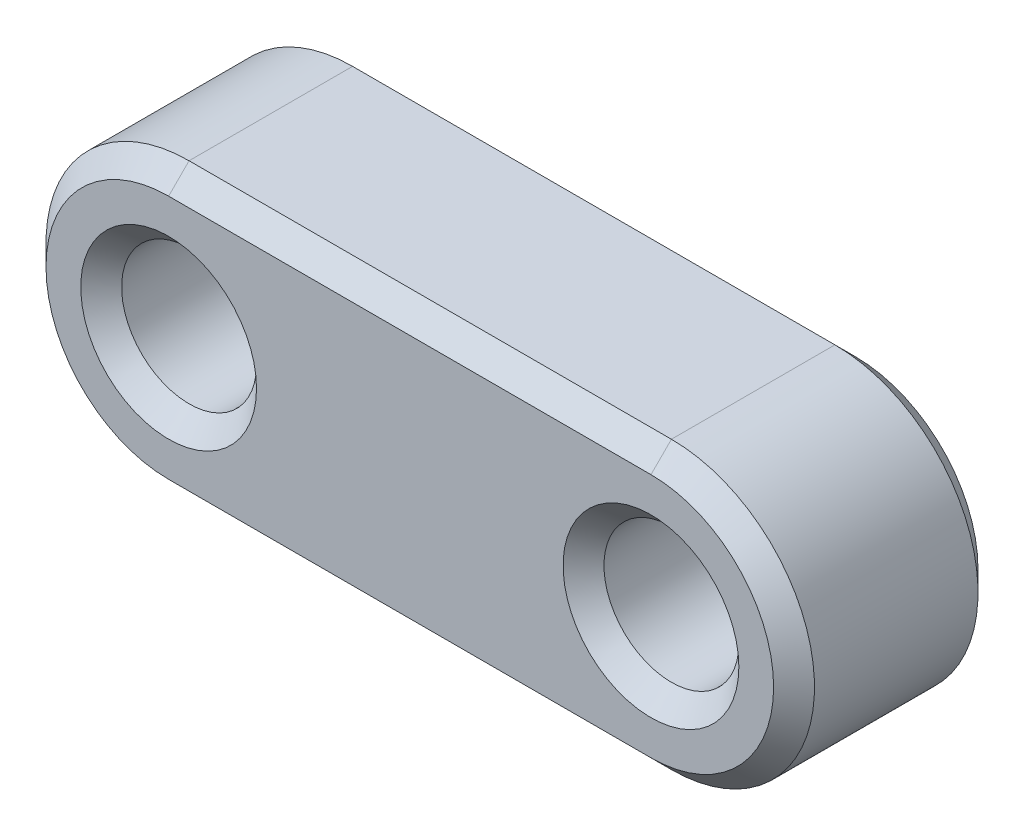
ISO-10303-21;
HEADER;
FILE_DESCRIPTION(('STEP AP214'),'2;1');
FILE_NAME('part.step','',(''),(''),'','','');
FILE_SCHEMA(('AUTOMOTIVE_DESIGN { 1 0 10303 214 1 1 1 1 }'));
ENDSEC;
DATA;
#1=APPLICATION_CONTEXT('core data for automotive mechanical design processes');
#2=APPLICATION_PROTOCOL_DEFINITION('international standard','automotive_design',2000,#1);
#3=PRODUCT_CONTEXT('',#1,'mechanical');
#4=PRODUCT('Part','Part','',(#3));
#5=PRODUCT_RELATED_PRODUCT_CATEGORY('part','',(#4));
#6=PRODUCT_DEFINITION_FORMATION('','',#4);
#7=PRODUCT_DEFINITION_CONTEXT('part definition',#1,'design');
#8=PRODUCT_DEFINITION('design','',#6,#7);
#9=PRODUCT_DEFINITION_SHAPE('','',#8);
#10=(LENGTH_UNIT() NAMED_UNIT(*) SI_UNIT(.MILLI.,.METRE.));
#11=(NAMED_UNIT(*) PLANE_ANGLE_UNIT() SI_UNIT($,.RADIAN.));
#12=(NAMED_UNIT(*) SI_UNIT($,.STERADIAN.) SOLID_ANGLE_UNIT());
#13=UNCERTAINTY_MEASURE_WITH_UNIT(LENGTH_MEASURE(1.E-05),#10,'distance_accuracy_value','');
#14=(GEOMETRIC_REPRESENTATION_CONTEXT(3) GLOBAL_UNCERTAINTY_ASSIGNED_CONTEXT((#13)) GLOBAL_UNIT_ASSIGNED_CONTEXT((#10,
#11,#12)) REPRESENTATION_CONTEXT('',''));
#15=CARTESIAN_POINT('',(0.,0.,0.));
#16=DIRECTION('',(0.,0.,1.));
#17=DIRECTION('',(1.,0.,0.));
#18=AXIS2_PLACEMENT_3D('',#15,#16,#17);
#19=CARTESIAN_POINT('',(-5.9,0.,5.));
#20=DIRECTION('',(0.,0.,1.));
#21=DIRECTION('',(1.,0.,0.));
#22=AXIS2_PLACEMENT_3D('',#19,#20,#21);
#23=PLANE('',#22);
#24=CARTESIAN_POINT('',(-5.9,0.,5.));
#25=DIRECTION('',(0.,0.,1.));
#26=DIRECTION('',(1.,0.,0.));
#27=AXIS2_PLACEMENT_3D('',#24,#25,#26);
#28=CIRCLE('',#27,3.);
#29=CARTESIAN_POINT('',(-5.9,3.,5.));
#30=VERTEX_POINT('',#29);
#31=CARTESIAN_POINT('',(-5.9,-3.,5.));
#32=VERTEX_POINT('',#31);
#33=EDGE_CURVE('E63',#30,#32,#28,.T.);
#34=ORIENTED_EDGE('',*,*,#33,.T.);
#35=DIRECTION('',(1.,0.,0.));
#36=VECTOR('',#35,1.);
#37=CARTESIAN_POINT('',(5.9,-3.,5.));
#38=LINE('',#37,#36);
#39=CARTESIAN_POINT('',(5.9,-3.,5.));
#40=VERTEX_POINT('',#39);
#41=EDGE_CURVE('E11',#32,#40,#38,.T.);
#42=ORIENTED_EDGE('',*,*,#41,.T.);
#43=CARTESIAN_POINT('',(5.9,0.,5.));
#44=DIRECTION('',(0.,0.,1.));
#45=DIRECTION('',(1.,0.,0.));
#46=AXIS2_PLACEMENT_3D('',#43,#44,#45);
#47=CIRCLE('',#46,3.);
#48=CARTESIAN_POINT('',(5.9,3.,5.));
#49=VERTEX_POINT('',#48);
#50=EDGE_CURVE('E48',#40,#49,#47,.T.);
#51=ORIENTED_EDGE('',*,*,#50,.T.);
#52=DIRECTION('',(-1.,0.,0.));
#53=VECTOR('',#52,1.);
#54=CARTESIAN_POINT('',(-5.9,3.,5.));
#55=LINE('',#54,#53);
#56=EDGE_CURVE('E162',#49,#30,#55,.T.);
#57=ORIENTED_EDGE('',*,*,#56,.T.);
#58=EDGE_LOOP('',(#34,#42,#51,#57));
#59=FACE_BOUND('',#58,.T.);
#60=CARTESIAN_POINT('',(5.9,0.,5.));
#61=DIRECTION('',(0.,0.,1.));
#62=DIRECTION('',(1.,0.,0.));
#63=AXIS2_PLACEMENT_3D('',#60,#61,#62);
#64=CIRCLE('',#63,2.15000000000001);
#65=CARTESIAN_POINT('',(8.05000000000001,0.,5.));
#66=VERTEX_POINT('',#65);
#67=EDGE_CURVE('E164',#66,#66,#64,.F.);
#68=ORIENTED_EDGE('',*,*,#67,.T.);
#69=EDGE_LOOP('',(#68));
#70=FACE_BOUND('',#69,.T.);
#71=CARTESIAN_POINT('',(-5.9,0.,5.));
#72=DIRECTION('',(0.,0.,1.));
#73=DIRECTION('',(1.,0.,0.));
#74=AXIS2_PLACEMENT_3D('',#71,#72,#73);
#75=CIRCLE('',#74,2.15000000000001);
#76=CARTESIAN_POINT('',(-3.74999999999999,0.,5.));
#77=VERTEX_POINT('',#76);
#78=EDGE_CURVE('E167',#77,#77,#75,.F.);
#79=ORIENTED_EDGE('',*,*,#78,.T.);
#80=EDGE_LOOP('',(#79));
#81=FACE_BOUND('',#80,.T.);
#82=ADVANCED_FACE('F38',(#59,#70,#81),#23,.T.);
#83=CARTESIAN_POINT('',(-5.9,0.,0.));
#84=DIRECTION('',(0.,0.,1.));
#85=DIRECTION('',(1.,0.,0.));
#86=AXIS2_PLACEMENT_3D('',#83,#84,#85);
#87=PLANE('',#86);
#88=CARTESIAN_POINT('',(5.9,0.,0.));
#89=DIRECTION('',(0.,0.,1.));
#90=DIRECTION('',(1.,0.,0.));
#91=AXIS2_PLACEMENT_3D('',#88,#89,#90);
#92=CIRCLE('',#91,2.15);
#93=CARTESIAN_POINT('',(8.05,0.,0.));
#94=VERTEX_POINT('',#93);
#95=EDGE_CURVE('E199',#94,#94,#92,.T.);
#96=ORIENTED_EDGE('',*,*,#95,.T.);
#97=EDGE_LOOP('',(#96));
#98=FACE_BOUND('',#97,.T.);
#99=CARTESIAN_POINT('',(-5.9,0.,0.));
#100=DIRECTION('',(0.,0.,1.));
#101=DIRECTION('',(1.,0.,0.));
#102=AXIS2_PLACEMENT_3D('',#99,#100,#101);
#103=CIRCLE('',#102,2.15);
#104=CARTESIAN_POINT('',(-3.75,0.,0.));
#105=VERTEX_POINT('',#104);
#106=EDGE_CURVE('E202',#105,#105,#103,.T.);
#107=ORIENTED_EDGE('',*,*,#106,.T.);
#108=EDGE_LOOP('',(#107));
#109=FACE_BOUND('',#108,.T.);
#110=DIRECTION('',(1.,0.,0.));
#111=VECTOR('',#110,1.);
#112=CARTESIAN_POINT('',(-5.9,3.,0.));
#113=LINE('',#112,#111);
#114=CARTESIAN_POINT('',(-5.9,3.,0.));
#115=VERTEX_POINT('',#114);
#116=CARTESIAN_POINT('',(5.9,3.,0.));
#117=VERTEX_POINT('',#116);
#118=EDGE_CURVE('E118',#115,#117,#113,.T.);
#119=ORIENTED_EDGE('',*,*,#118,.T.);
#120=CARTESIAN_POINT('',(5.9,0.,0.));
#121=DIRECTION('',(0.,0.,1.));
#122=DIRECTION('',(1.,0.,0.));
#123=AXIS2_PLACEMENT_3D('',#120,#121,#122);
#124=CIRCLE('',#123,3.);
#125=CARTESIAN_POINT('',(5.9,-3.,0.));
#126=VERTEX_POINT('',#125);
#127=EDGE_CURVE('E114',#117,#126,#124,.F.);
#128=ORIENTED_EDGE('',*,*,#127,.T.);
#129=DIRECTION('',(-1.,0.,0.));
#130=VECTOR('',#129,1.);
#131=CARTESIAN_POINT('',(-5.9,-3.,0.));
#132=LINE('',#131,#130);
#133=CARTESIAN_POINT('',(-5.9,-3.,0.));
#134=VERTEX_POINT('',#133);
#135=EDGE_CURVE('E108',#126,#134,#132,.T.);
#136=ORIENTED_EDGE('',*,*,#135,.T.);
#137=CARTESIAN_POINT('',(-5.9,0.,0.));
#138=DIRECTION('',(0.,0.,1.));
#139=DIRECTION('',(1.,0.,0.));
#140=AXIS2_PLACEMENT_3D('',#137,#138,#139);
#141=CIRCLE('',#140,3.);
#142=EDGE_CURVE('E111',#134,#115,#141,.F.);
#143=ORIENTED_EDGE('',*,*,#142,.T.);
#144=EDGE_LOOP('',(#119,#128,#136,#143));
#145=FACE_BOUND('',#144,.T.);
#146=ADVANCED_FACE('F110',(#98,#109,#145),#87,.F.);
#147=CARTESIAN_POINT('',(-5.9,0.,5.));
#148=DIRECTION('',(0.,0.,-1.));
#149=DIRECTION('',(-1.,0.,0.));
#150=AXIS2_PLACEMENT_3D('',#147,#148,#149);
#151=CYLINDRICAL_SURFACE('',#150,3.5);
#152=DIRECTION('',(0.,0.,-1.));
#153=VECTOR('',#152,1.);
#154=CARTESIAN_POINT('',(-5.9,3.5,5.));
#155=LINE('',#154,#153);
#156=CARTESIAN_POINT('',(-5.9,3.5,4.5));
#157=VERTEX_POINT('',#156);
#158=CARTESIAN_POINT('',(-5.9,3.5,0.499999999999998));
#159=VERTEX_POINT('',#158);
#160=EDGE_CURVE('E133',#157,#159,#155,.T.);
#161=ORIENTED_EDGE('',*,*,#160,.T.);
#162=CARTESIAN_POINT('',(-5.9,0.,0.499999999999998));
#163=DIRECTION('',(0.,0.,1.));
#164=DIRECTION('',(1.,0.,0.));
#165=AXIS2_PLACEMENT_3D('',#162,#163,#164);
#166=CIRCLE('',#165,3.5);
#167=CARTESIAN_POINT('',(-5.9,-3.5,0.499999999999998));
#168=VERTEX_POINT('',#167);
#169=EDGE_CURVE('E170',#159,#168,#166,.T.);
#170=ORIENTED_EDGE('',*,*,#169,.T.);
#171=DIRECTION('',(0.,0.,-1.));
#172=VECTOR('',#171,1.);
#173=CARTESIAN_POINT('',(-5.9,-3.5,5.));
#174=LINE('',#173,#172);
#175=CARTESIAN_POINT('',(-5.9,-3.5,4.5));
#176=VERTEX_POINT('',#175);
#177=EDGE_CURVE('E129',#176,#168,#174,.T.);
#178=ORIENTED_EDGE('',*,*,#177,.F.);
#179=CARTESIAN_POINT('',(-5.9,0.,4.5));
#180=DIRECTION('',(0.,0.,1.));
#181=DIRECTION('',(1.,0.,0.));
#182=AXIS2_PLACEMENT_3D('',#179,#180,#181);
#183=CIRCLE('',#182,3.5);
#184=EDGE_CURVE('E172',#176,#157,#183,.F.);
#185=ORIENTED_EDGE('',*,*,#184,.T.);
#186=EDGE_LOOP('',(#161,#170,#178,#185));
#187=FACE_BOUND('',#186,.T.);
#188=ADVANCED_FACE('F232',(#187),#151,.T.);
#189=CARTESIAN_POINT('',(-5.9,-3.5,5.));
#190=DIRECTION('',(0.,1.,0.));
#191=DIRECTION('',(-1.,0.,0.));
#192=AXIS2_PLACEMENT_3D('',#189,#190,#191);
#193=PLANE('',#192);
#194=ORIENTED_EDGE('',*,*,#177,.T.);
#195=DIRECTION('',(1.,0.,0.));
#196=VECTOR('',#195,1.);
#197=CARTESIAN_POINT('',(-5.9,-3.5,0.499999999999998));
#198=LINE('',#197,#196);
#199=CARTESIAN_POINT('',(5.9,-3.5,0.499999999999998));
#200=VERTEX_POINT('',#199);
#201=EDGE_CURVE('E132',#168,#200,#198,.T.);
#202=ORIENTED_EDGE('',*,*,#201,.T.);
#203=DIRECTION('',(0.,0.,-1.));
#204=VECTOR('',#203,1.);
#205=CARTESIAN_POINT('',(5.9,-3.5,5.));
#206=LINE('',#205,#204);
#207=CARTESIAN_POINT('',(5.9,-3.5,4.5));
#208=VERTEX_POINT('',#207);
#209=EDGE_CURVE('E209',#208,#200,#206,.T.);
#210=ORIENTED_EDGE('',*,*,#209,.F.);
#211=DIRECTION('',(-1.,0.,0.));
#212=VECTOR('',#211,1.);
#213=CARTESIAN_POINT('',(-5.9,-3.5,4.5));
#214=LINE('',#213,#212);
#215=EDGE_CURVE('E175',#208,#176,#214,.T.);
#216=ORIENTED_EDGE('',*,*,#215,.T.);
#217=EDGE_LOOP('',(#194,#202,#210,#216));
#218=FACE_BOUND('',#217,.T.);
#219=ADVANCED_FACE('F231',(#218),#193,.F.);
#220=CARTESIAN_POINT('',(5.9,0.,5.));
#221=DIRECTION('',(0.,0.,-1.));
#222=DIRECTION('',(-1.,0.,0.));
#223=AXIS2_PLACEMENT_3D('',#220,#221,#222);
#224=CYLINDRICAL_SURFACE('',#223,3.5);
#225=ORIENTED_EDGE('',*,*,#209,.T.);
#226=CARTESIAN_POINT('',(5.9,0.,0.499999999999998));
#227=DIRECTION('',(0.,0.,1.));
#228=DIRECTION('',(1.,0.,0.));
#229=AXIS2_PLACEMENT_3D('',#226,#227,#228);
#230=CIRCLE('',#229,3.5);
#231=CARTESIAN_POINT('',(5.9,3.5,0.499999999999998));
#232=VERTEX_POINT('',#231);
#233=EDGE_CURVE('E182',#200,#232,#230,.T.);
#234=ORIENTED_EDGE('',*,*,#233,.T.);
#235=DIRECTION('',(0.,0.,-1.));
#236=VECTOR('',#235,1.);
#237=CARTESIAN_POINT('',(5.9,3.5,5.));
#238=LINE('',#237,#236);
#239=CARTESIAN_POINT('',(5.9,3.5,4.5));
#240=VERTEX_POINT('',#239);
#241=EDGE_CURVE('E136',#240,#232,#238,.T.);
#242=ORIENTED_EDGE('',*,*,#241,.F.);
#243=CARTESIAN_POINT('',(5.9,0.,4.5));
#244=DIRECTION('',(0.,0.,1.));
#245=DIRECTION('',(1.,0.,0.));
#246=AXIS2_PLACEMENT_3D('',#243,#244,#245);
#247=CIRCLE('',#246,3.5);
#248=EDGE_CURVE('E185',#240,#208,#247,.F.);
#249=ORIENTED_EDGE('',*,*,#248,.T.);
#250=EDGE_LOOP('',(#225,#234,#242,#249));
#251=FACE_BOUND('',#250,.T.);
#252=ADVANCED_FACE('F219',(#251),#224,.T.);
#253=CARTESIAN_POINT('',(-5.9,3.5,5.));
#254=DIRECTION('',(0.,-1.,0.));
#255=DIRECTION('',(1.,0.,0.));
#256=AXIS2_PLACEMENT_3D('',#253,#254,#255);
#257=PLANE('',#256);
#258=ORIENTED_EDGE('',*,*,#241,.T.);
#259=DIRECTION('',(-1.,0.,0.));
#260=VECTOR('',#259,1.);
#261=CARTESIAN_POINT('',(-5.9,3.5,0.499999999999998));
#262=LINE('',#261,#260);
#263=EDGE_CURVE('E178',#232,#159,#262,.T.);
#264=ORIENTED_EDGE('',*,*,#263,.T.);
#265=ORIENTED_EDGE('',*,*,#160,.F.);
#266=DIRECTION('',(1.,0.,0.));
#267=VECTOR('',#266,1.);
#268=CARTESIAN_POINT('',(5.9,3.5,4.5));
#269=LINE('',#268,#267);
#270=EDGE_CURVE('E180',#157,#240,#269,.T.);
#271=ORIENTED_EDGE('',*,*,#270,.T.);
#272=EDGE_LOOP('',(#258,#264,#265,#271));
#273=FACE_BOUND('',#272,.T.);
#274=ADVANCED_FACE('F215',(#273),#257,.F.);
#275=CARTESIAN_POINT('',(5.9,0.,5.));
#276=DIRECTION('',(0.,0.,-1.));
#277=DIRECTION('',(-1.,0.,0.));
#278=AXIS2_PLACEMENT_3D('',#275,#276,#277);
#279=CYLINDRICAL_SURFACE('',#278,1.65);
#280=CARTESIAN_POINT('',(5.9,0.,0.500000000000005));
#281=DIRECTION('',(0.,0.,1.));
#282=DIRECTION('',(1.,0.,0.));
#283=AXIS2_PLACEMENT_3D('',#280,#281,#282);
#284=CIRCLE('',#283,1.65);
#285=CARTESIAN_POINT('',(7.55,0.,0.500000000000005));
#286=VERTEX_POINT('',#285);
#287=EDGE_CURVE('E193',#286,#286,#284,.F.);
#288=ORIENTED_EDGE('',*,*,#287,.T.);
#289=EDGE_LOOP('',(#288));
#290=FACE_BOUND('',#289,.T.);
#291=CARTESIAN_POINT('',(5.9,0.,4.5));
#292=DIRECTION('',(0.,0.,1.));
#293=DIRECTION('',(1.,0.,0.));
#294=AXIS2_PLACEMENT_3D('',#291,#292,#293);
#295=CIRCLE('',#294,1.65);
#296=CARTESIAN_POINT('',(7.55,0.,4.5));
#297=VERTEX_POINT('',#296);
#298=EDGE_CURVE('E196',#297,#297,#295,.T.);
#299=ORIENTED_EDGE('',*,*,#298,.T.);
#300=EDGE_LOOP('',(#299));
#301=FACE_BOUND('',#300,.T.);
#302=ADVANCED_FACE('F254',(#290,#301),#279,.F.);
#303=CARTESIAN_POINT('',(-5.9,0.,5.));
#304=DIRECTION('',(0.,0.,-1.));
#305=DIRECTION('',(-1.,0.,0.));
#306=AXIS2_PLACEMENT_3D('',#303,#304,#305);
#307=CYLINDRICAL_SURFACE('',#306,1.65);
#308=CARTESIAN_POINT('',(-5.9,0.,0.500000000000005));
#309=DIRECTION('',(0.,0.,1.));
#310=DIRECTION('',(1.,0.,0.));
#311=AXIS2_PLACEMENT_3D('',#308,#309,#310);
#312=CIRCLE('',#311,1.65);
#313=CARTESIAN_POINT('',(-4.25,0.,0.500000000000005));
#314=VERTEX_POINT('',#313);
#315=EDGE_CURVE('E187',#314,#314,#312,.F.);
#316=ORIENTED_EDGE('',*,*,#315,.T.);
#317=EDGE_LOOP('',(#316));
#318=FACE_BOUND('',#317,.T.);
#319=CARTESIAN_POINT('',(-5.9,0.,4.5));
#320=DIRECTION('',(0.,0.,1.));
#321=DIRECTION('',(1.,0.,0.));
#322=AXIS2_PLACEMENT_3D('',#319,#320,#321);
#323=CIRCLE('',#322,1.65);
#324=CARTESIAN_POINT('',(-4.25,0.,4.5));
#325=VERTEX_POINT('',#324);
#326=EDGE_CURVE('E190',#325,#325,#323,.T.);
#327=ORIENTED_EDGE('',*,*,#326,.T.);
#328=EDGE_LOOP('',(#327));
#329=FACE_BOUND('',#328,.T.);
#330=ADVANCED_FACE('F272',(#318,#329),#307,.F.);
#331=CARTESIAN_POINT('',(5.9,0.,0.));
#332=DIRECTION('',(0.,0.,-1.));
#333=DIRECTION('',(-1.,0.,0.));
#334=AXIS2_PLACEMENT_3D('',#331,#332,#333);
#335=CONICAL_SURFACE('',#334,2.15,0.785398163397446);
#336=ORIENTED_EDGE('',*,*,#287,.F.);
#337=EDGE_LOOP('',(#336));
#338=FACE_BOUND('',#337,.T.);
#339=ORIENTED_EDGE('',*,*,#95,.F.);
#340=EDGE_LOOP('',(#339));
#341=FACE_BOUND('',#340,.T.);
#342=ADVANCED_FACE('F266',(#338,#341),#335,.F.);
#343=CARTESIAN_POINT('',(-5.9,0.,0.));
#344=DIRECTION('',(0.,0.,-1.));
#345=DIRECTION('',(-1.,0.,0.));
#346=AXIS2_PLACEMENT_3D('',#343,#344,#345);
#347=CONICAL_SURFACE('',#346,2.15,0.785398163397446);
#348=ORIENTED_EDGE('',*,*,#315,.F.);
#349=EDGE_LOOP('',(#348));
#350=FACE_BOUND('',#349,.T.);
#351=ORIENTED_EDGE('',*,*,#106,.F.);
#352=EDGE_LOOP('',(#351));
#353=FACE_BOUND('',#352,.T.);
#354=ADVANCED_FACE('F271',(#350,#353),#347,.F.);
#355=CARTESIAN_POINT('',(-5.9,0.,0.499999999999998));
#356=DIRECTION('',(0.,0.,1.));
#357=DIRECTION('',(1.,0.,0.));
#358=AXIS2_PLACEMENT_3D('',#355,#356,#357);
#359=CONICAL_SURFACE('',#358,3.5,0.785398163397451);
#360=DIRECTION('',(0.,0.707106781186549,0.707106781186546));
#361=VECTOR('',#360,1.);
#362=CARTESIAN_POINT('',(-5.9,3.,0.));
#363=LINE('',#362,#361);
#364=EDGE_CURVE('E127',#115,#159,#363,.T.);
#365=ORIENTED_EDGE('',*,*,#364,.F.);
#366=ORIENTED_EDGE('',*,*,#142,.F.);
#367=DIRECTION('',(0.,0.707106781186549,-0.707106781186546));
#368=VECTOR('',#367,1.);
#369=CARTESIAN_POINT('',(-5.9,-3.5,0.499999999999998));
#370=LINE('',#369,#368);
#371=EDGE_CURVE('E124',#168,#134,#370,.T.);
#372=ORIENTED_EDGE('',*,*,#371,.F.);
#373=ORIENTED_EDGE('',*,*,#169,.F.);
#374=EDGE_LOOP('',(#365,#366,#372,#373));
#375=FACE_BOUND('',#374,.T.);
#376=ADVANCED_FACE('F122',(#375),#359,.T.);
#377=CARTESIAN_POINT('',(-5.9,-3.5,0.499999999999998));
#378=DIRECTION('',(0.,0.707106781186546,0.707106781186549));
#379=DIRECTION('',(1.,0.,0.));
#380=AXIS2_PLACEMENT_3D('',#377,#378,#379);
#381=PLANE('',#380);
#382=ORIENTED_EDGE('',*,*,#371,.T.);
#383=ORIENTED_EDGE('',*,*,#135,.F.);
#384=DIRECTION('',(0.,0.707106781186549,-0.707106781186546));
#385=VECTOR('',#384,1.);
#386=CARTESIAN_POINT('',(5.9,-3.5,0.499999999999998));
#387=LINE('',#386,#385);
#388=EDGE_CURVE('E138',#200,#126,#387,.T.);
#389=ORIENTED_EDGE('',*,*,#388,.F.);
#390=ORIENTED_EDGE('',*,*,#201,.F.);
#391=EDGE_LOOP('',(#382,#383,#389,#390));
#392=FACE_BOUND('',#391,.T.);
#393=ADVANCED_FACE('F131',(#392),#381,.F.);
#394=CARTESIAN_POINT('',(-5.9,3.5,0.499999999999998));
#395=DIRECTION('',(0.,-0.707106781186546,0.707106781186549));
#396=DIRECTION('',(-1.,0.,0.));
#397=AXIS2_PLACEMENT_3D('',#394,#395,#396);
#398=PLANE('',#397);
#399=ORIENTED_EDGE('',*,*,#364,.T.);
#400=ORIENTED_EDGE('',*,*,#263,.F.);
#401=DIRECTION('',(0.,0.707106781186549,0.707106781186546));
#402=VECTOR('',#401,1.);
#403=CARTESIAN_POINT('',(5.9,3.,0.));
#404=LINE('',#403,#402);
#405=EDGE_CURVE('E150',#117,#232,#404,.T.);
#406=ORIENTED_EDGE('',*,*,#405,.F.);
#407=ORIENTED_EDGE('',*,*,#118,.F.);
#408=EDGE_LOOP('',(#399,#400,#406,#407));
#409=FACE_BOUND('',#408,.T.);
#410=ADVANCED_FACE('F234',(#409),#398,.F.);
#411=CARTESIAN_POINT('',(5.9,0.,0.499999999999998));
#412=DIRECTION('',(0.,0.,1.));
#413=DIRECTION('',(1.,0.,0.));
#414=AXIS2_PLACEMENT_3D('',#411,#412,#413);
#415=CONICAL_SURFACE('',#414,3.5,0.785398163397451);
#416=ORIENTED_EDGE('',*,*,#388,.T.);
#417=ORIENTED_EDGE('',*,*,#127,.F.);
#418=ORIENTED_EDGE('',*,*,#405,.T.);
#419=ORIENTED_EDGE('',*,*,#233,.F.);
#420=EDGE_LOOP('',(#416,#417,#418,#419));
#421=FACE_BOUND('',#420,.T.);
#422=ADVANCED_FACE('F235',(#421),#415,.T.);
#423=CARTESIAN_POINT('',(-5.9,3.,5.));
#424=DIRECTION('',(0.,0.707106781186547,0.707106781186547));
#425=DIRECTION('',(1.,0.,0.));
#426=AXIS2_PLACEMENT_3D('',#423,#424,#425);
#427=PLANE('',#426);
#428=DIRECTION('',(0.,-0.707106781186547,0.707106781186547));
#429=VECTOR('',#428,1.);
#430=CARTESIAN_POINT('',(5.9,3.5,4.5));
#431=LINE('',#430,#429);
#432=EDGE_CURVE('E144',#240,#49,#431,.T.);
#433=ORIENTED_EDGE('',*,*,#432,.F.);
#434=ORIENTED_EDGE('',*,*,#270,.F.);
#435=DIRECTION('',(0.,0.707106781186547,-0.707106781186547));
#436=VECTOR('',#435,1.);
#437=CARTESIAN_POINT('',(-5.9,3.,5.));
#438=LINE('',#437,#436);
#439=EDGE_CURVE('E43',#30,#157,#438,.T.);
#440=ORIENTED_EDGE('',*,*,#439,.F.);
#441=ORIENTED_EDGE('',*,*,#56,.F.);
#442=EDGE_LOOP('',(#433,#434,#440,#441));
#443=FACE_BOUND('',#442,.T.);
#444=ADVANCED_FACE('F223',(#443),#427,.T.);
#445=CARTESIAN_POINT('',(-5.9,0.,5.));
#446=DIRECTION('',(0.,0.,-1.));
#447=DIRECTION('',(-1.,0.,0.));
#448=AXIS2_PLACEMENT_3D('',#445,#446,#447);
#449=CONICAL_SURFACE('',#448,3.,0.785398163397448);
#450=ORIENTED_EDGE('',*,*,#439,.T.);
#451=ORIENTED_EDGE('',*,*,#184,.F.);
#452=DIRECTION('',(0.,-0.707106781186547,-0.707106781186547));
#453=VECTOR('',#452,1.);
#454=CARTESIAN_POINT('',(-5.9,-3.,5.));
#455=LINE('',#454,#453);
#456=EDGE_CURVE('E143',#32,#176,#455,.T.);
#457=ORIENTED_EDGE('',*,*,#456,.F.);
#458=ORIENTED_EDGE('',*,*,#33,.F.);
#459=EDGE_LOOP('',(#450,#451,#457,#458));
#460=FACE_BOUND('',#459,.T.);
#461=ADVANCED_FACE('F227',(#460),#449,.T.);
#462=CARTESIAN_POINT('',(5.9,0.,5.));
#463=DIRECTION('',(0.,0.,-1.));
#464=DIRECTION('',(-1.,0.,0.));
#465=AXIS2_PLACEMENT_3D('',#462,#463,#464);
#466=CONICAL_SURFACE('',#465,3.,0.785398163397448);
#467=ORIENTED_EDGE('',*,*,#432,.T.);
#468=ORIENTED_EDGE('',*,*,#50,.F.);
#469=DIRECTION('',(0.,0.707106781186547,0.707106781186547));
#470=VECTOR('',#469,1.);
#471=CARTESIAN_POINT('',(5.9,-3.5,4.5));
#472=LINE('',#471,#470);
#473=EDGE_CURVE('E56',#208,#40,#472,.T.);
#474=ORIENTED_EDGE('',*,*,#473,.F.);
#475=ORIENTED_EDGE('',*,*,#248,.F.);
#476=EDGE_LOOP('',(#467,#468,#474,#475));
#477=FACE_BOUND('',#476,.T.);
#478=ADVANCED_FACE('F224',(#477),#466,.T.);
#479=CARTESIAN_POINT('',(-5.9,-3.,5.));
#480=DIRECTION('',(0.,-0.707106781186547,0.707106781186547));
#481=DIRECTION('',(-1.,0.,0.));
#482=AXIS2_PLACEMENT_3D('',#479,#480,#481);
#483=PLANE('',#482);
#484=ORIENTED_EDGE('',*,*,#456,.T.);
#485=ORIENTED_EDGE('',*,*,#215,.F.);
#486=ORIENTED_EDGE('',*,*,#473,.T.);
#487=ORIENTED_EDGE('',*,*,#41,.F.);
#488=EDGE_LOOP('',(#484,#485,#486,#487));
#489=FACE_BOUND('',#488,.T.);
#490=ADVANCED_FACE('F226',(#489),#483,.T.);
#491=CARTESIAN_POINT('',(5.9,0.,4.5));
#492=DIRECTION('',(0.,0.,1.));
#493=DIRECTION('',(1.,0.,0.));
#494=AXIS2_PLACEMENT_3D('',#491,#492,#493);
#495=CONICAL_SURFACE('',#494,1.65,0.785398163397452);
#496=ORIENTED_EDGE('',*,*,#67,.F.);
#497=EDGE_LOOP('',(#496));
#498=FACE_BOUND('',#497,.T.);
#499=ORIENTED_EDGE('',*,*,#298,.F.);
#500=EDGE_LOOP('',(#499));
#501=FACE_BOUND('',#500,.T.);
#502=ADVANCED_FACE('F293',(#498,#501),#495,.F.);
#503=CARTESIAN_POINT('',(-5.9,0.,4.5));
#504=DIRECTION('',(0.,0.,1.));
#505=DIRECTION('',(1.,0.,0.));
#506=AXIS2_PLACEMENT_3D('',#503,#504,#505);
#507=CONICAL_SURFACE('',#506,1.65,0.785398163397452);
#508=ORIENTED_EDGE('',*,*,#78,.F.);
#509=EDGE_LOOP('',(#508));
#510=FACE_BOUND('',#509,.T.);
#511=ORIENTED_EDGE('',*,*,#326,.F.);
#512=EDGE_LOOP('',(#511));
#513=FACE_BOUND('',#512,.T.);
#514=ADVANCED_FACE('F41',(#510,#513),#507,.F.);
#515=CLOSED_SHELL('',(#82,#146,#188,#219,#252,#274,#302,#330,#342,#354,#376,#393,#410,#422,#444,
#461,#478,#490,#502,#514));
#516=MANIFOLD_SOLID_BREP('B2',#515);
#517=ADVANCED_BREP_SHAPE_REPRESENTATION('',(#18,#516),#14);
#518=SHAPE_DEFINITION_REPRESENTATION(#9,#517);
ENDSEC;
END-ISO-10303-21;
